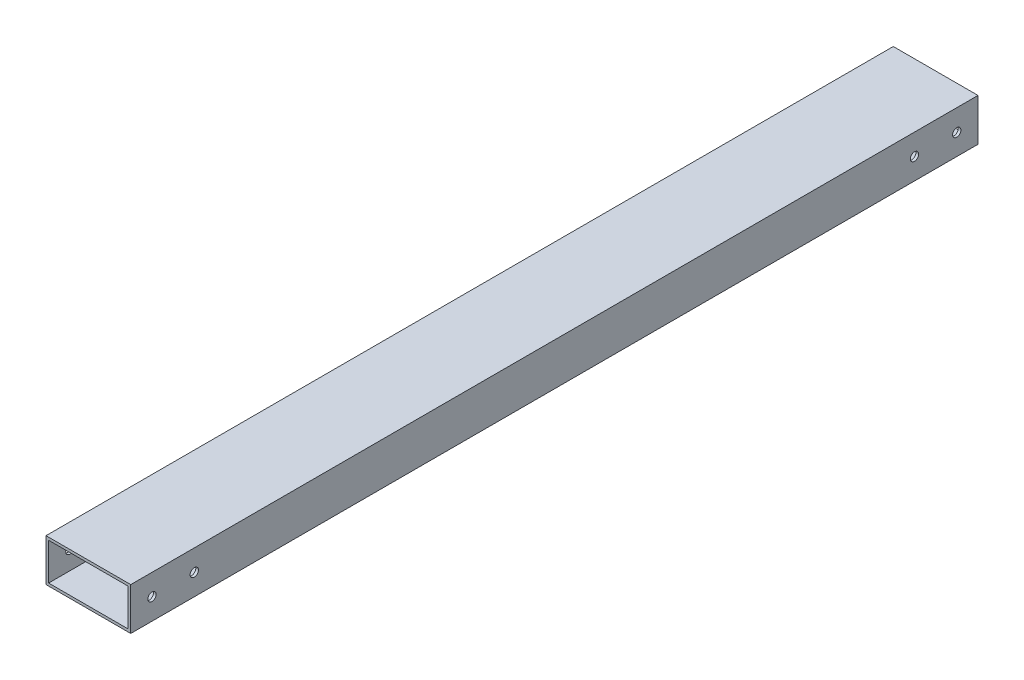
ISO-10303-21;
HEADER;
FILE_DESCRIPTION(('STEP AP214'),'2;1');
FILE_NAME('part.step','',(''),(''),'','','');
FILE_SCHEMA(('AUTOMOTIVE_DESIGN { 1 0 10303 214 1 1 1 1 }'));
ENDSEC;
DATA;
#1=APPLICATION_CONTEXT('core data for automotive mechanical design processes');
#2=APPLICATION_PROTOCOL_DEFINITION('international standard','automotive_design',2000,#1);
#3=PRODUCT_CONTEXT('',#1,'mechanical');
#4=PRODUCT('Part','Part','',(#3));
#5=PRODUCT_RELATED_PRODUCT_CATEGORY('part','',(#4));
#6=PRODUCT_DEFINITION_FORMATION('','',#4);
#7=PRODUCT_DEFINITION_CONTEXT('part definition',#1,'design');
#8=PRODUCT_DEFINITION('design','',#6,#7);
#9=PRODUCT_DEFINITION_SHAPE('','',#8);
#10=(LENGTH_UNIT() NAMED_UNIT(*) SI_UNIT(.MILLI.,.METRE.));
#11=(NAMED_UNIT(*) PLANE_ANGLE_UNIT() SI_UNIT($,.RADIAN.));
#12=(NAMED_UNIT(*) SI_UNIT($,.STERADIAN.) SOLID_ANGLE_UNIT());
#13=UNCERTAINTY_MEASURE_WITH_UNIT(LENGTH_MEASURE(1.E-05),#10,'distance_accuracy_value','');
#14=(GEOMETRIC_REPRESENTATION_CONTEXT(3) GLOBAL_UNCERTAINTY_ASSIGNED_CONTEXT((#13)) GLOBAL_UNIT_ASSIGNED_CONTEXT((#10,
#11,#12)) REPRESENTATION_CONTEXT('',''));
#15=CARTESIAN_POINT('',(0.,0.,0.));
#16=DIRECTION('',(0.,0.,1.));
#17=DIRECTION('',(1.,0.,0.));
#18=AXIS2_PLACEMENT_3D('',#15,#16,#17);
#19=CARTESIAN_POINT('',(0.,0.,254.000000508));
#20=DIRECTION('',(0.,0.,1.));
#21=DIRECTION('',(1.,0.,0.));
#22=AXIS2_PLACEMENT_3D('',#19,#20,#21);
#23=PLANE('',#22);
#24=DIRECTION('',(0.,-1.,0.));
#25=VECTOR('',#24,1.);
#26=CARTESIAN_POINT('',(-25.4,12.7,254.000000508));
#27=LINE('',#26,#25);
#28=CARTESIAN_POINT('',(-25.4,12.7,254.000000508));
#29=VERTEX_POINT('',#28);
#30=CARTESIAN_POINT('',(-25.4,-12.7,254.000000508));
#31=VERTEX_POINT('',#30);
#32=EDGE_CURVE('E114',#29,#31,#27,.T.);
#33=ORIENTED_EDGE('',*,*,#32,.T.);
#34=DIRECTION('',(1.,0.,0.));
#35=VECTOR('',#34,1.);
#36=CARTESIAN_POINT('',(-25.4,-12.7,254.000000508));
#37=LINE('',#36,#35);
#38=CARTESIAN_POINT('',(25.4,-12.7,254.000000508));
#39=VERTEX_POINT('',#38);
#40=EDGE_CURVE('E162',#31,#39,#37,.T.);
#41=ORIENTED_EDGE('',*,*,#40,.T.);
#42=DIRECTION('',(0.,1.,0.));
#43=VECTOR('',#42,1.);
#44=CARTESIAN_POINT('',(25.4,-12.7,254.000000508));
#45=LINE('',#44,#43);
#46=CARTESIAN_POINT('',(25.4,12.7,254.000000508));
#47=VERTEX_POINT('',#46);
#48=EDGE_CURVE('E164',#39,#47,#45,.T.);
#49=ORIENTED_EDGE('',*,*,#48,.T.);
#50=DIRECTION('',(-1.,0.,0.));
#51=VECTOR('',#50,1.);
#52=CARTESIAN_POINT('',(25.4,12.7,254.000000508));
#53=LINE('',#52,#51);
#54=EDGE_CURVE('E61',#47,#29,#53,.T.);
#55=ORIENTED_EDGE('',*,*,#54,.T.);
#56=EDGE_LOOP('',(#33,#41,#49,#55));
#57=FACE_BOUND('',#56,.T.);
#58=DIRECTION('',(1.,0.,0.));
#59=VECTOR('',#58,1.);
#60=CARTESIAN_POINT('',(-23.8125,-11.1125,254.000000508));
#61=LINE('',#60,#59);
#62=CARTESIAN_POINT('',(-23.8125,-11.1125,254.000000508));
#63=VERTEX_POINT('',#62);
#64=CARTESIAN_POINT('',(23.8125,-11.1125,254.000000508));
#65=VERTEX_POINT('',#64);
#66=EDGE_CURVE('E151',#63,#65,#61,.T.);
#67=ORIENTED_EDGE('',*,*,#66,.F.);
#68=DIRECTION('',(0.,-1.,0.));
#69=VECTOR('',#68,1.);
#70=CARTESIAN_POINT('',(-23.8125,11.1125,254.000000508));
#71=LINE('',#70,#69);
#72=CARTESIAN_POINT('',(-23.8125,11.1125,254.000000508));
#73=VERTEX_POINT('',#72);
#74=EDGE_CURVE('E111',#73,#63,#71,.T.);
#75=ORIENTED_EDGE('',*,*,#74,.F.);
#76=DIRECTION('',(-1.,0.,0.));
#77=VECTOR('',#76,1.);
#78=CARTESIAN_POINT('',(23.8125,11.1125,254.000000508));
#79=LINE('',#78,#77);
#80=CARTESIAN_POINT('',(23.8125,11.1125,254.000000508));
#81=VERTEX_POINT('',#80);
#82=EDGE_CURVE('E155',#81,#73,#79,.T.);
#83=ORIENTED_EDGE('',*,*,#82,.F.);
#84=DIRECTION('',(0.,1.,0.));
#85=VECTOR('',#84,1.);
#86=CARTESIAN_POINT('',(23.8125,-11.1125,254.000000508));
#87=LINE('',#86,#85);
#88=EDGE_CURVE('E153',#65,#81,#87,.T.);
#89=ORIENTED_EDGE('',*,*,#88,.F.);
#90=EDGE_LOOP('',(#67,#75,#83,#89));
#91=FACE_BOUND('',#90,.T.);
#92=ADVANCED_FACE('F36',(#57,#91),#23,.T.);
#93=CARTESIAN_POINT('',(-25.4,12.7,254.000000508));
#94=DIRECTION('',(1.,0.,0.));
#95=DIRECTION('',(0.,0.,-1.));
#96=AXIS2_PLACEMENT_3D('',#93,#94,#95);
#97=PLANE('',#96);
#98=CARTESIAN_POINT('',(-25.4,1.33226762955019E-12,215.900000508));
#99=DIRECTION('',(1.,0.,0.));
#100=DIRECTION('',(0.,0.,-1.));
#101=AXIS2_PLACEMENT_3D('',#98,#99,#100);
#102=CIRCLE('',#101,2.48919999999999);
#103=CARTESIAN_POINT('',(-25.4,1.33226762955019E-12,213.410800508));
#104=VERTEX_POINT('',#103);
#105=EDGE_CURVE('E402',#104,#104,#102,.T.);
#106=ORIENTED_EDGE('',*,*,#105,.T.);
#107=EDGE_LOOP('',(#106));
#108=FACE_BOUND('',#107,.T.);
#109=CARTESIAN_POINT('',(-25.4,3.88578058618805E-12,241.261771093305));
#110=DIRECTION('',(1.,0.,0.));
#111=DIRECTION('',(0.,0.,-1.));
#112=AXIS2_PLACEMENT_3D('',#109,#110,#111);
#113=CIRCLE('',#112,2.48919999999999);
#114=CARTESIAN_POINT('',(-25.4,3.88578058618805E-12,238.772571093305));
#115=VERTEX_POINT('',#114);
#116=EDGE_CURVE('E177',#115,#115,#113,.T.);
#117=ORIENTED_EDGE('',*,*,#116,.T.);
#118=EDGE_LOOP('',(#117));
#119=FACE_BOUND('',#118,.T.);
#120=CARTESIAN_POINT('',(-25.4,-2.45201369108907E-11,-215.899999492));
#121=DIRECTION('',(1.,0.,0.));
#122=DIRECTION('',(0.,0.,-1.));
#123=AXIS2_PLACEMENT_3D('',#120,#121,#122);
#124=CIRCLE('',#123,2.48919999999999);
#125=CARTESIAN_POINT('',(-25.4,-2.45201369108907E-11,-218.389199492));
#126=VERTEX_POINT('',#125);
#127=EDGE_CURVE('E195',#126,#126,#124,.T.);
#128=ORIENTED_EDGE('',*,*,#127,.T.);
#129=EDGE_LOOP('',(#128));
#130=FACE_BOUND('',#129,.T.);
#131=CARTESIAN_POINT('',(-25.4,-0.16345408931006,-241.261770077309));
#132=DIRECTION('',(1.,0.,0.));
#133=DIRECTION('',(0.,0.,-1.));
#134=AXIS2_PLACEMENT_3D('',#131,#132,#133);
#135=CIRCLE('',#134,2.48919999999999);
#136=CARTESIAN_POINT('',(-25.4,-0.16345408931006,-243.750970077309));
#137=VERTEX_POINT('',#136);
#138=EDGE_CURVE('E173',#137,#137,#135,.T.);
#139=ORIENTED_EDGE('',*,*,#138,.T.);
#140=EDGE_LOOP('',(#139));
#141=FACE_BOUND('',#140,.T.);
#142=DIRECTION('',(0.,0.,-1.));
#143=VECTOR('',#142,1.);
#144=CARTESIAN_POINT('',(-25.4,12.7,254.000000508));
#145=LINE('',#144,#143);
#146=CARTESIAN_POINT('',(-25.4,12.7,-254.000000508));
#147=VERTEX_POINT('',#146);
#148=EDGE_CURVE('E167',#29,#147,#145,.T.);
#149=ORIENTED_EDGE('',*,*,#148,.T.);
#150=DIRECTION('',(0.,-1.,0.));
#151=VECTOR('',#150,1.);
#152=CARTESIAN_POINT('',(-25.4,12.7,-254.000000508));
#153=LINE('',#152,#151);
#154=CARTESIAN_POINT('',(-25.4,-12.7,-254.000000508));
#155=VERTEX_POINT('',#154);
#156=EDGE_CURVE('E138',#147,#155,#153,.T.);
#157=ORIENTED_EDGE('',*,*,#156,.T.);
#158=DIRECTION('',(0.,0.,-1.));
#159=VECTOR('',#158,1.);
#160=CARTESIAN_POINT('',(-25.4,-12.7,254.000000508));
#161=LINE('',#160,#159);
#162=EDGE_CURVE('E11',#31,#155,#161,.T.);
#163=ORIENTED_EDGE('',*,*,#162,.F.);
#164=ORIENTED_EDGE('',*,*,#32,.F.);
#165=EDGE_LOOP('',(#149,#157,#163,#164));
#166=FACE_BOUND('',#165,.T.);
#167=ADVANCED_FACE('F38',(#108,#119,#130,#141,#166),#97,.F.);
#168=CARTESIAN_POINT('',(-25.4,-12.7,254.000000508));
#169=DIRECTION('',(0.,1.,0.));
#170=DIRECTION('',(-1.,0.,0.));
#171=AXIS2_PLACEMENT_3D('',#168,#169,#170);
#172=PLANE('',#171);
#173=ORIENTED_EDGE('',*,*,#162,.T.);
#174=DIRECTION('',(1.,0.,0.));
#175=VECTOR('',#174,1.);
#176=CARTESIAN_POINT('',(-25.4,-12.7,-254.000000508));
#177=LINE('',#176,#175);
#178=CARTESIAN_POINT('',(25.4,-12.7,-254.000000508));
#179=VERTEX_POINT('',#178);
#180=EDGE_CURVE('E141',#155,#179,#177,.T.);
#181=ORIENTED_EDGE('',*,*,#180,.T.);
#182=DIRECTION('',(0.,0.,-1.));
#183=VECTOR('',#182,1.);
#184=CARTESIAN_POINT('',(25.4,-12.7,254.000000508));
#185=LINE('',#184,#183);
#186=EDGE_CURVE('E45',#39,#179,#185,.T.);
#187=ORIENTED_EDGE('',*,*,#186,.F.);
#188=ORIENTED_EDGE('',*,*,#40,.F.);
#189=EDGE_LOOP('',(#173,#181,#187,#188));
#190=FACE_BOUND('',#189,.T.);
#191=ADVANCED_FACE('F231',(#190),#172,.F.);
#192=CARTESIAN_POINT('',(25.4,-12.7,254.000000508));
#193=DIRECTION('',(-1.,0.,0.));
#194=DIRECTION('',(0.,0.,1.));
#195=AXIS2_PLACEMENT_3D('',#192,#193,#194);
#196=PLANE('',#195);
#197=CARTESIAN_POINT('',(25.4,1.33226762955019E-12,215.900000508));
#198=DIRECTION('',(1.,0.,0.));
#199=DIRECTION('',(0.,0.,-1.));
#200=AXIS2_PLACEMENT_3D('',#197,#198,#199);
#201=CIRCLE('',#200,2.48919999999999);
#202=CARTESIAN_POINT('',(25.4,1.33226762955019E-12,213.410800508));
#203=VERTEX_POINT('',#202);
#204=EDGE_CURVE('E401',#203,#203,#201,.T.);
#205=ORIENTED_EDGE('',*,*,#204,.F.);
#206=EDGE_LOOP('',(#205));
#207=FACE_BOUND('',#206,.T.);
#208=CARTESIAN_POINT('',(25.4,3.88578058618805E-12,241.261771093305));
#209=DIRECTION('',(1.,0.,0.));
#210=DIRECTION('',(0.,0.,-1.));
#211=AXIS2_PLACEMENT_3D('',#208,#209,#210);
#212=CIRCLE('',#211,2.48919999999999);
#213=CARTESIAN_POINT('',(25.4,3.88578058618805E-12,238.772571093305));
#214=VERTEX_POINT('',#213);
#215=EDGE_CURVE('E184',#214,#214,#212,.T.);
#216=ORIENTED_EDGE('',*,*,#215,.F.);
#217=EDGE_LOOP('',(#216));
#218=FACE_BOUND('',#217,.T.);
#219=CARTESIAN_POINT('',(25.4,-2.45201369108907E-11,-215.899999492));
#220=DIRECTION('',(1.,0.,0.));
#221=DIRECTION('',(0.,0.,-1.));
#222=AXIS2_PLACEMENT_3D('',#219,#220,#221);
#223=CIRCLE('',#222,2.48919999999999);
#224=CARTESIAN_POINT('',(25.4,-2.45201369108907E-11,-218.389199492));
#225=VERTEX_POINT('',#224);
#226=EDGE_CURVE('E181',#225,#225,#223,.T.);
#227=ORIENTED_EDGE('',*,*,#226,.F.);
#228=EDGE_LOOP('',(#227));
#229=FACE_BOUND('',#228,.T.);
#230=CARTESIAN_POINT('',(25.4,-0.16345408931006,-241.261770077309));
#231=DIRECTION('',(1.,0.,0.));
#232=DIRECTION('',(0.,0.,-1.));
#233=AXIS2_PLACEMENT_3D('',#230,#231,#232);
#234=CIRCLE('',#233,2.48919999999999);
#235=CARTESIAN_POINT('',(25.4,-0.16345408931006,-243.750970077309));
#236=VERTEX_POINT('',#235);
#237=EDGE_CURVE('E204',#236,#236,#234,.T.);
#238=ORIENTED_EDGE('',*,*,#237,.F.);
#239=EDGE_LOOP('',(#238));
#240=FACE_BOUND('',#239,.T.);
#241=ORIENTED_EDGE('',*,*,#186,.T.);
#242=DIRECTION('',(0.,1.,0.));
#243=VECTOR('',#242,1.);
#244=CARTESIAN_POINT('',(25.4,-12.7,-254.000000508));
#245=LINE('',#244,#243);
#246=CARTESIAN_POINT('',(25.4,12.7,-254.000000508));
#247=VERTEX_POINT('',#246);
#248=EDGE_CURVE('E144',#179,#247,#245,.T.);
#249=ORIENTED_EDGE('',*,*,#248,.T.);
#250=DIRECTION('',(0.,0.,-1.));
#251=VECTOR('',#250,1.);
#252=CARTESIAN_POINT('',(25.4,12.7,254.000000508));
#253=LINE('',#252,#251);
#254=EDGE_CURVE('E169',#47,#247,#253,.T.);
#255=ORIENTED_EDGE('',*,*,#254,.F.);
#256=ORIENTED_EDGE('',*,*,#48,.F.);
#257=EDGE_LOOP('',(#241,#249,#255,#256));
#258=FACE_BOUND('',#257,.T.);
#259=ADVANCED_FACE('F240',(#207,#218,#229,#240,#258),#196,.F.);
#260=CARTESIAN_POINT('',(25.4,12.7,254.000000508));
#261=DIRECTION('',(0.,-1.,0.));
#262=DIRECTION('',(1.,0.,0.));
#263=AXIS2_PLACEMENT_3D('',#260,#261,#262);
#264=PLANE('',#263);
#265=ORIENTED_EDGE('',*,*,#254,.T.);
#266=DIRECTION('',(-1.,0.,0.));
#267=VECTOR('',#266,1.);
#268=CARTESIAN_POINT('',(25.4,12.7,-254.000000508));
#269=LINE('',#268,#267);
#270=EDGE_CURVE('E147',#247,#147,#269,.T.);
#271=ORIENTED_EDGE('',*,*,#270,.T.);
#272=ORIENTED_EDGE('',*,*,#148,.F.);
#273=ORIENTED_EDGE('',*,*,#54,.F.);
#274=EDGE_LOOP('',(#265,#271,#272,#273));
#275=FACE_BOUND('',#274,.T.);
#276=ADVANCED_FACE('F237',(#275),#264,.F.);
#277=CARTESIAN_POINT('',(-23.8125,11.1125,254.000000508));
#278=DIRECTION('',(1.,0.,0.));
#279=DIRECTION('',(0.,1.,0.));
#280=AXIS2_PLACEMENT_3D('',#277,#278,#279);
#281=PLANE('',#280);
#282=CARTESIAN_POINT('',(-23.8125,1.33226762955019E-12,215.900000508));
#283=DIRECTION('',(1.,0.,0.));
#284=DIRECTION('',(0.,1.,0.));
#285=AXIS2_PLACEMENT_3D('',#282,#283,#284);
#286=CIRCLE('',#285,2.48919999999999);
#287=CARTESIAN_POINT('',(-23.8125,2.48920000000132,215.900000508));
#288=VERTEX_POINT('',#287);
#289=EDGE_CURVE('E40',#288,#288,#286,.T.);
#290=ORIENTED_EDGE('',*,*,#289,.F.);
#291=EDGE_LOOP('',(#290));
#292=FACE_BOUND('',#291,.T.);
#293=CARTESIAN_POINT('',(-23.8125,3.88578058618805E-12,241.261771093305));
#294=DIRECTION('',(1.,0.,0.));
#295=DIRECTION('',(0.,1.,0.));
#296=AXIS2_PLACEMENT_3D('',#293,#294,#295);
#297=CIRCLE('',#296,2.48919999999999);
#298=CARTESIAN_POINT('',(-23.8125,2.48920000000388,241.261771093305));
#299=VERTEX_POINT('',#298);
#300=EDGE_CURVE('E174',#299,#299,#297,.T.);
#301=ORIENTED_EDGE('',*,*,#300,.F.);
#302=EDGE_LOOP('',(#301));
#303=FACE_BOUND('',#302,.T.);
#304=CARTESIAN_POINT('',(-23.8125,-2.45201369108907E-11,-215.899999492));
#305=DIRECTION('',(1.,0.,0.));
#306=DIRECTION('',(0.,1.,0.));
#307=AXIS2_PLACEMENT_3D('',#304,#305,#306);
#308=CIRCLE('',#307,2.48919999999999);
#309=CARTESIAN_POINT('',(-23.8125,2.48919999997547,-215.899999492));
#310=VERTEX_POINT('',#309);
#311=EDGE_CURVE('E201',#310,#310,#308,.T.);
#312=ORIENTED_EDGE('',*,*,#311,.F.);
#313=EDGE_LOOP('',(#312));
#314=FACE_BOUND('',#313,.T.);
#315=CARTESIAN_POINT('',(-23.8125,-0.16345408931006,-241.261770077309));
#316=DIRECTION('',(1.,0.,0.));
#317=DIRECTION('',(0.,1.,0.));
#318=AXIS2_PLACEMENT_3D('',#315,#316,#317);
#319=CIRCLE('',#318,2.48919999999999);
#320=CARTESIAN_POINT('',(-23.8125,2.32574591068993,-241.261770077309));
#321=VERTEX_POINT('',#320);
#322=EDGE_CURVE('E132',#321,#321,#319,.T.);
#323=ORIENTED_EDGE('',*,*,#322,.F.);
#324=EDGE_LOOP('',(#323));
#325=FACE_BOUND('',#324,.T.);
#326=DIRECTION('',(0.,0.,-1.));
#327=VECTOR('',#326,1.);
#328=CARTESIAN_POINT('',(-23.8125,-11.1125,254.000000508));
#329=LINE('',#328,#327);
#330=CARTESIAN_POINT('',(-23.8125,-11.1125,-254.000000508));
#331=VERTEX_POINT('',#330);
#332=EDGE_CURVE('E103',#63,#331,#329,.T.);
#333=ORIENTED_EDGE('',*,*,#332,.T.);
#334=DIRECTION('',(0.,-1.,0.));
#335=VECTOR('',#334,1.);
#336=CARTESIAN_POINT('',(-23.8125,11.1125,-254.000000508));
#337=LINE('',#336,#335);
#338=CARTESIAN_POINT('',(-23.8125,11.1125,-254.000000508));
#339=VERTEX_POINT('',#338);
#340=EDGE_CURVE('E108',#339,#331,#337,.T.);
#341=ORIENTED_EDGE('',*,*,#340,.F.);
#342=DIRECTION('',(0.,0.,-1.));
#343=VECTOR('',#342,1.);
#344=CARTESIAN_POINT('',(-23.8125,11.1125,254.000000508));
#345=LINE('',#344,#343);
#346=EDGE_CURVE('E157',#73,#339,#345,.T.);
#347=ORIENTED_EDGE('',*,*,#346,.F.);
#348=ORIENTED_EDGE('',*,*,#74,.T.);
#349=EDGE_LOOP('',(#333,#341,#347,#348));
#350=FACE_BOUND('',#349,.T.);
#351=ADVANCED_FACE('F105',(#292,#303,#314,#325,#350),#281,.T.);
#352=CARTESIAN_POINT('',(-23.8125,-11.1125,254.000000508));
#353=DIRECTION('',(0.,1.,0.));
#354=DIRECTION('',(0.,0.,1.));
#355=AXIS2_PLACEMENT_3D('',#352,#353,#354);
#356=PLANE('',#355);
#357=DIRECTION('',(0.,0.,-1.));
#358=VECTOR('',#357,1.);
#359=CARTESIAN_POINT('',(23.8125,-11.1125,254.000000508));
#360=LINE('',#359,#358);
#361=CARTESIAN_POINT('',(23.8125,-11.1125,-254.000000508));
#362=VERTEX_POINT('',#361);
#363=EDGE_CURVE('E115',#65,#362,#360,.T.);
#364=ORIENTED_EDGE('',*,*,#363,.T.);
#365=DIRECTION('',(1.,0.,0.));
#366=VECTOR('',#365,1.);
#367=CARTESIAN_POINT('',(-23.8125,-11.1125,-254.000000508));
#368=LINE('',#367,#366);
#369=EDGE_CURVE('E118',#331,#362,#368,.T.);
#370=ORIENTED_EDGE('',*,*,#369,.F.);
#371=ORIENTED_EDGE('',*,*,#332,.F.);
#372=ORIENTED_EDGE('',*,*,#66,.T.);
#373=EDGE_LOOP('',(#364,#370,#371,#372));
#374=FACE_BOUND('',#373,.T.);
#375=ADVANCED_FACE('F119',(#374),#356,.T.);
#376=CARTESIAN_POINT('',(23.8125,-11.1125,254.000000508));
#377=DIRECTION('',(-1.,0.,0.));
#378=DIRECTION('',(0.,0.,1.));
#379=AXIS2_PLACEMENT_3D('',#376,#377,#378);
#380=PLANE('',#379);
#381=CARTESIAN_POINT('',(23.8125,1.33226762955019E-12,215.900000508));
#382=DIRECTION('',(-1.,0.,0.));
#383=DIRECTION('',(0.,0.,1.));
#384=AXIS2_PLACEMENT_3D('',#381,#382,#383);
#385=CIRCLE('',#384,2.48919999999999);
#386=CARTESIAN_POINT('',(23.8125,1.33226762955019E-12,218.389200508));
#387=VERTEX_POINT('',#386);
#388=EDGE_CURVE('E189',#387,#387,#385,.T.);
#389=ORIENTED_EDGE('',*,*,#388,.F.);
#390=EDGE_LOOP('',(#389));
#391=FACE_BOUND('',#390,.T.);
#392=CARTESIAN_POINT('',(23.8125,3.88578058618805E-12,241.261771093305));
#393=DIRECTION('',(-1.,0.,0.));
#394=DIRECTION('',(0.,0.,1.));
#395=AXIS2_PLACEMENT_3D('',#392,#393,#394);
#396=CIRCLE('',#395,2.48919999999999);
#397=CARTESIAN_POINT('',(23.8125,3.88578058618805E-12,243.750971093305));
#398=VERTEX_POINT('',#397);
#399=EDGE_CURVE('E176',#398,#398,#396,.T.);
#400=ORIENTED_EDGE('',*,*,#399,.F.);
#401=EDGE_LOOP('',(#400));
#402=FACE_BOUND('',#401,.T.);
#403=CARTESIAN_POINT('',(23.8125,-2.45201369108907E-11,-215.899999492));
#404=DIRECTION('',(-1.,0.,0.));
#405=DIRECTION('',(0.,0.,1.));
#406=AXIS2_PLACEMENT_3D('',#403,#404,#405);
#407=CIRCLE('',#406,2.48919999999999);
#408=CARTESIAN_POINT('',(23.8125,-2.45201369108907E-11,-213.410799492));
#409=VERTEX_POINT('',#408);
#410=EDGE_CURVE('E198',#409,#409,#407,.T.);
#411=ORIENTED_EDGE('',*,*,#410,.F.);
#412=EDGE_LOOP('',(#411));
#413=FACE_BOUND('',#412,.T.);
#414=CARTESIAN_POINT('',(23.8125,-0.16345408931006,-241.261770077309));
#415=DIRECTION('',(-1.,0.,0.));
#416=DIRECTION('',(0.,0.,1.));
#417=AXIS2_PLACEMENT_3D('',#414,#415,#416);
#418=CIRCLE('',#417,2.48919999999999);
#419=CARTESIAN_POINT('',(23.8125,-0.16345408931006,-238.772570077309));
#420=VERTEX_POINT('',#419);
#421=EDGE_CURVE('E129',#420,#420,#418,.T.);
#422=ORIENTED_EDGE('',*,*,#421,.F.);
#423=EDGE_LOOP('',(#422));
#424=FACE_BOUND('',#423,.T.);
#425=DIRECTION('',(0.,0.,-1.));
#426=VECTOR('',#425,1.);
#427=CARTESIAN_POINT('',(23.8125,11.1125,254.000000508));
#428=LINE('',#427,#426);
#429=CARTESIAN_POINT('',(23.8125,11.1125,-254.000000508));
#430=VERTEX_POINT('',#429);
#431=EDGE_CURVE('E53',#81,#430,#428,.T.);
#432=ORIENTED_EDGE('',*,*,#431,.T.);
#433=DIRECTION('',(0.,1.,0.));
#434=VECTOR('',#433,1.);
#435=CARTESIAN_POINT('',(23.8125,-11.1125,-254.000000508));
#436=LINE('',#435,#434);
#437=EDGE_CURVE('E124',#362,#430,#436,.T.);
#438=ORIENTED_EDGE('',*,*,#437,.F.);
#439=ORIENTED_EDGE('',*,*,#363,.F.);
#440=ORIENTED_EDGE('',*,*,#88,.T.);
#441=EDGE_LOOP('',(#432,#438,#439,#440));
#442=FACE_BOUND('',#441,.T.);
#443=ADVANCED_FACE('F288',(#391,#402,#413,#424,#442),#380,.T.);
#444=CARTESIAN_POINT('',(23.8125,11.1125,254.000000508));
#445=DIRECTION('',(0.,-1.,0.));
#446=DIRECTION('',(0.,0.,-1.));
#447=AXIS2_PLACEMENT_3D('',#444,#445,#446);
#448=PLANE('',#447);
#449=ORIENTED_EDGE('',*,*,#346,.T.);
#450=DIRECTION('',(-1.,0.,0.));
#451=VECTOR('',#450,1.);
#452=CARTESIAN_POINT('',(23.8125,11.1125,-254.000000508));
#453=LINE('',#452,#451);
#454=EDGE_CURVE('E128',#430,#339,#453,.T.);
#455=ORIENTED_EDGE('',*,*,#454,.F.);
#456=ORIENTED_EDGE('',*,*,#431,.F.);
#457=ORIENTED_EDGE('',*,*,#82,.T.);
#458=EDGE_LOOP('',(#449,#455,#456,#457));
#459=FACE_BOUND('',#458,.T.);
#460=ADVANCED_FACE('F222',(#459),#448,.T.);
#461=CARTESIAN_POINT('',(0.,0.,-254.000000508));
#462=DIRECTION('',(0.,0.,1.));
#463=DIRECTION('',(1.,0.,0.));
#464=AXIS2_PLACEMENT_3D('',#461,#462,#463);
#465=PLANE('',#464);
#466=ORIENTED_EDGE('',*,*,#454,.T.);
#467=ORIENTED_EDGE('',*,*,#340,.T.);
#468=ORIENTED_EDGE('',*,*,#369,.T.);
#469=ORIENTED_EDGE('',*,*,#437,.T.);
#470=EDGE_LOOP('',(#466,#467,#468,#469));
#471=FACE_BOUND('',#470,.T.);
#472=ORIENTED_EDGE('',*,*,#156,.F.);
#473=ORIENTED_EDGE('',*,*,#270,.F.);
#474=ORIENTED_EDGE('',*,*,#248,.F.);
#475=ORIENTED_EDGE('',*,*,#180,.F.);
#476=EDGE_LOOP('',(#472,#473,#474,#475));
#477=FACE_BOUND('',#476,.T.);
#478=ADVANCED_FACE('F126',(#471,#477),#465,.F.);
#479=CARTESIAN_POINT('',(25.4,-0.16345408931006,-241.261770077309));
#480=DIRECTION('',(1.,0.,0.));
#481=DIRECTION('',(0.,0.,-1.));
#482=AXIS2_PLACEMENT_3D('',#479,#480,#481);
#483=CYLINDRICAL_SURFACE('',#482,2.48919999999999);
#484=ORIENTED_EDGE('',*,*,#322,.T.);
#485=EDGE_LOOP('',(#484));
#486=FACE_BOUND('',#485,.T.);
#487=ORIENTED_EDGE('',*,*,#138,.F.);
#488=EDGE_LOOP('',(#487));
#489=FACE_BOUND('',#488,.T.);
#490=ADVANCED_FACE('F211',(#486,#489),#483,.F.);
#491=ORIENTED_EDGE('',*,*,#421,.T.);
#492=EDGE_LOOP('',(#491));
#493=FACE_BOUND('',#492,.T.);
#494=ORIENTED_EDGE('',*,*,#237,.T.);
#495=EDGE_LOOP('',(#494));
#496=FACE_BOUND('',#495,.T.);
#497=ADVANCED_FACE('F213',(#493,#496),#483,.F.);
#498=CARTESIAN_POINT('',(25.4,-2.45201369108907E-11,-215.899999492));
#499=DIRECTION('',(1.,0.,0.));
#500=DIRECTION('',(0.,0.,-1.));
#501=AXIS2_PLACEMENT_3D('',#498,#499,#500);
#502=CYLINDRICAL_SURFACE('',#501,2.48919999999999);
#503=ORIENTED_EDGE('',*,*,#410,.T.);
#504=EDGE_LOOP('',(#503));
#505=FACE_BOUND('',#504,.T.);
#506=ORIENTED_EDGE('',*,*,#226,.T.);
#507=EDGE_LOOP('',(#506));
#508=FACE_BOUND('',#507,.T.);
#509=ADVANCED_FACE('F220',(#505,#508),#502,.F.);
#510=ORIENTED_EDGE('',*,*,#311,.T.);
#511=EDGE_LOOP('',(#510));
#512=FACE_BOUND('',#511,.T.);
#513=ORIENTED_EDGE('',*,*,#127,.F.);
#514=EDGE_LOOP('',(#513));
#515=FACE_BOUND('',#514,.T.);
#516=ADVANCED_FACE('F336',(#512,#515),#502,.F.);
#517=CARTESIAN_POINT('',(25.4,3.88578058618805E-12,241.261771093305));
#518=DIRECTION('',(1.,0.,0.));
#519=DIRECTION('',(0.,0.,-1.));
#520=AXIS2_PLACEMENT_3D('',#517,#518,#519);
#521=CYLINDRICAL_SURFACE('',#520,2.48919999999999);
#522=ORIENTED_EDGE('',*,*,#300,.T.);
#523=EDGE_LOOP('',(#522));
#524=FACE_BOUND('',#523,.T.);
#525=ORIENTED_EDGE('',*,*,#116,.F.);
#526=EDGE_LOOP('',(#525));
#527=FACE_BOUND('',#526,.T.);
#528=ADVANCED_FACE('F346',(#524,#527),#521,.F.);
#529=ORIENTED_EDGE('',*,*,#399,.T.);
#530=EDGE_LOOP('',(#529));
#531=FACE_BOUND('',#530,.T.);
#532=ORIENTED_EDGE('',*,*,#215,.T.);
#533=EDGE_LOOP('',(#532));
#534=FACE_BOUND('',#533,.T.);
#535=ADVANCED_FACE('F356',(#531,#534),#521,.F.);
#536=CARTESIAN_POINT('',(25.4,1.33226762955019E-12,215.900000508));
#537=DIRECTION('',(1.,0.,0.));
#538=DIRECTION('',(0.,0.,-1.));
#539=AXIS2_PLACEMENT_3D('',#536,#537,#538);
#540=CYLINDRICAL_SURFACE('',#539,2.48919999999999);
#541=ORIENTED_EDGE('',*,*,#289,.T.);
#542=EDGE_LOOP('',(#541));
#543=FACE_BOUND('',#542,.T.);
#544=ORIENTED_EDGE('',*,*,#105,.F.);
#545=EDGE_LOOP('',(#544));
#546=FACE_BOUND('',#545,.T.);
#547=ADVANCED_FACE('F366',(#543,#546),#540,.F.);
#548=ORIENTED_EDGE('',*,*,#388,.T.);
#549=EDGE_LOOP('',(#548));
#550=FACE_BOUND('',#549,.T.);
#551=ORIENTED_EDGE('',*,*,#204,.T.);
#552=EDGE_LOOP('',(#551));
#553=FACE_BOUND('',#552,.T.);
#554=ADVANCED_FACE('F376',(#550,#553),#540,.F.);
#555=CLOSED_SHELL('',(#92,#167,#191,#259,#276,#351,#375,#443,#460,#478,#490,#497,#509,#516,#528,
#535,#547,#554));
#556=MANIFOLD_SOLID_BREP('B2',#555);
#557=ADVANCED_BREP_SHAPE_REPRESENTATION('',(#18,#556),#14);
#558=SHAPE_DEFINITION_REPRESENTATION(#9,#557);
ENDSEC;
END-ISO-10303-21;
